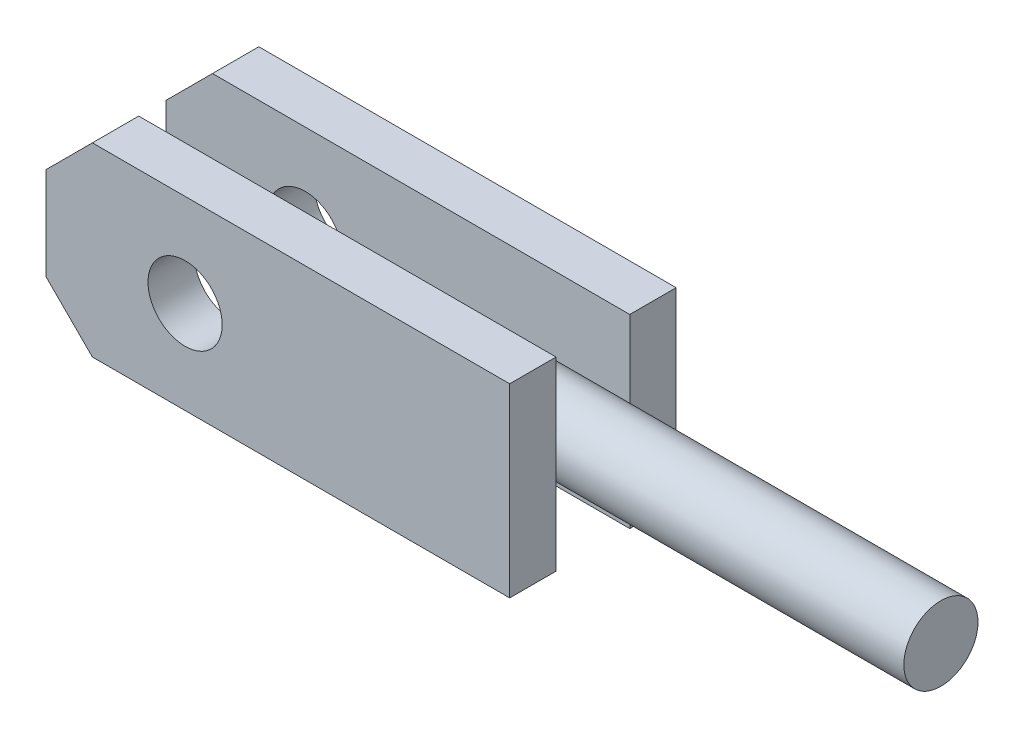
ISO-10303-21;
HEADER;
FILE_DESCRIPTION(('STEP AP214'),'2;1');
FILE_NAME('part.step','',(''),(''),'','','');
FILE_SCHEMA(('AUTOMOTIVE_DESIGN { 1 0 10303 214 1 1 1 1 }'));
ENDSEC;
DATA;
#1=APPLICATION_CONTEXT('core data for automotive mechanical design processes');
#2=APPLICATION_PROTOCOL_DEFINITION('international standard','automotive_design',2000,#1);
#3=PRODUCT_CONTEXT('',#1,'mechanical');
#4=PRODUCT('Part','Part','',(#3));
#5=PRODUCT_RELATED_PRODUCT_CATEGORY('part','',(#4));
#6=PRODUCT_DEFINITION_FORMATION('','',#4);
#7=PRODUCT_DEFINITION_CONTEXT('part definition',#1,'design');
#8=PRODUCT_DEFINITION('design','',#6,#7);
#9=PRODUCT_DEFINITION_SHAPE('','',#8);
#10=(LENGTH_UNIT() NAMED_UNIT(*) SI_UNIT(.MILLI.,.METRE.));
#11=(NAMED_UNIT(*) PLANE_ANGLE_UNIT() SI_UNIT($,.RADIAN.));
#12=(NAMED_UNIT(*) SI_UNIT($,.STERADIAN.) SOLID_ANGLE_UNIT());
#13=UNCERTAINTY_MEASURE_WITH_UNIT(LENGTH_MEASURE(1.E-05),#10,'distance_accuracy_value','');
#14=(GEOMETRIC_REPRESENTATION_CONTEXT(3) GLOBAL_UNCERTAINTY_ASSIGNED_CONTEXT((#13)) GLOBAL_UNIT_ASSIGNED_CONTEXT((#10,
#11,#12)) REPRESENTATION_CONTEXT('',''));
#15=CARTESIAN_POINT('',(0.,0.,0.));
#16=DIRECTION('',(0.,0.,1.));
#17=DIRECTION('',(1.,0.,0.));
#18=AXIS2_PLACEMENT_3D('',#15,#16,#17);
#19=CARTESIAN_POINT('',(30.,0.,-8.));
#20=DIRECTION('',(1.,0.,0.));
#21=DIRECTION('',(0.,0.,-1.));
#22=AXIS2_PLACEMENT_3D('',#19,#20,#21);
#23=CYLINDRICAL_SURFACE('',#22,8.);
#24=DIRECTION('',(1.,0.,0.));
#25=VECTOR('',#24,1.);
#26=CARTESIAN_POINT('',(30.,-1.26095202129188,-15.9));
#27=LINE('',#26,#25);
#28=CARTESIAN_POINT('',(50.,-1.26095202129188,-15.9));
#29=VERTEX_POINT('',#28);
#30=CARTESIAN_POINT('',(30.,-1.26095202129188,-15.9));
#31=VERTEX_POINT('',#30);
#32=EDGE_CURVE('E154',#29,#31,#27,.F.);
#33=ORIENTED_EDGE('',*,*,#32,.F.);
#34=CARTESIAN_POINT('',(50.,0.,-8.));
#35=DIRECTION('',(-1.,0.,0.));
#36=DIRECTION('',(0.,0.,1.));
#37=AXIS2_PLACEMENT_3D('',#34,#35,#36);
#38=CIRCLE('',#37,8.);
#39=CARTESIAN_POINT('',(50.,1.26095202129188,-15.9));
#40=VERTEX_POINT('',#39);
#41=EDGE_CURVE('E135',#29,#40,#38,.F.);
#42=ORIENTED_EDGE('',*,*,#41,.T.);
#43=DIRECTION('',(1.,0.,0.));
#44=VECTOR('',#43,1.);
#45=CARTESIAN_POINT('',(30.,1.26095202129188,-15.9));
#46=LINE('',#45,#44);
#47=CARTESIAN_POINT('',(30.,1.26095202129188,-15.9));
#48=VERTEX_POINT('',#47);
#49=EDGE_CURVE('E129',#48,#40,#46,.T.);
#50=ORIENTED_EDGE('',*,*,#49,.F.);
#51=CARTESIAN_POINT('',(30.,0.,-8.));
#52=DIRECTION('',(1.,0.,0.));
#53=DIRECTION('',(0.,0.,-1.));
#54=AXIS2_PLACEMENT_3D('',#51,#52,#53);
#55=CIRCLE('',#54,8.);
#56=EDGE_CURVE('E159',#48,#31,#55,.T.);
#57=ORIENTED_EDGE('',*,*,#56,.T.);
#58=EDGE_LOOP('',(#33,#42,#50,#57));
#59=FACE_BOUND('',#58,.T.);
#60=CARTESIAN_POINT('',(125.,0.,-8.));
#61=DIRECTION('',(1.,0.,0.));
#62=DIRECTION('',(0.,0.,-1.));
#63=AXIS2_PLACEMENT_3D('',#60,#61,#62);
#64=CIRCLE('',#63,8.);
#65=CARTESIAN_POINT('',(125.,0.,-16.));
#66=VERTEX_POINT('',#65);
#67=EDGE_CURVE('E156',#66,#66,#64,.T.);
#68=ORIENTED_EDGE('',*,*,#67,.F.);
#69=EDGE_LOOP('',(#68));
#70=FACE_BOUND('',#69,.T.);
#71=ADVANCED_FACE('F45',(#59,#70),#23,.T.);
#72=CARTESIAN_POINT('',(30.,0.,-8.));
#73=DIRECTION('',(1.,0.,0.));
#74=DIRECTION('',(0.,0.,-1.));
#75=AXIS2_PLACEMENT_3D('',#72,#73,#74);
#76=PLANE('',#75);
#77=ORIENTED_EDGE('',*,*,#56,.F.);
#78=DIRECTION('',(0.,-1.,0.));
#79=VECTOR('',#78,1.);
#80=CARTESIAN_POINT('',(30.,0.,-15.9));
#81=LINE('',#80,#79);
#82=EDGE_CURVE('E162',#48,#31,#81,.T.);
#83=ORIENTED_EDGE('',*,*,#82,.T.);
#84=EDGE_LOOP('',(#77,#83));
#85=FACE_BOUND('',#84,.T.);
#86=ADVANCED_FACE('F209',(#85),#76,.F.);
#87=CARTESIAN_POINT('',(125.,0.,-8.));
#88=DIRECTION('',(1.,0.,0.));
#89=DIRECTION('',(0.,0.,-1.));
#90=AXIS2_PLACEMENT_3D('',#87,#88,#89);
#91=PLANE('',#90);
#92=ORIENTED_EDGE('',*,*,#67,.T.);
#93=EDGE_LOOP('',(#92));
#94=FACE_BOUND('',#93,.T.);
#95=ADVANCED_FACE('F215',(#94),#91,.T.);
#96=CARTESIAN_POINT('',(-50.,-20.,-15.9));
#97=DIRECTION('',(1.,0.,0.));
#98=DIRECTION('',(0.,1.,0.));
#99=AXIS2_PLACEMENT_3D('',#96,#97,#98);
#100=PLANE('',#99);
#101=DIRECTION('',(0.,-1.,0.));
#102=VECTOR('',#101,1.);
#103=CARTESIAN_POINT('',(-50.,-20.,-25.9));
#104=LINE('',#103,#102);
#105=CARTESIAN_POINT('',(-50.,10.,-25.9));
#106=VERTEX_POINT('',#105);
#107=CARTESIAN_POINT('',(-50.,-9.99999999999997,-25.9));
#108=VERTEX_POINT('',#107);
#109=EDGE_CURVE('E142',#106,#108,#104,.T.);
#110=ORIENTED_EDGE('',*,*,#109,.T.);
#111=DIRECTION('',(0.,0.,1.));
#112=VECTOR('',#111,1.);
#113=CARTESIAN_POINT('',(-50.,-9.99999999999997,-15.9));
#114=LINE('',#113,#112);
#115=CARTESIAN_POINT('',(-50.,-9.99999999999997,-15.9));
#116=VERTEX_POINT('',#115);
#117=EDGE_CURVE('E53',#108,#116,#114,.T.);
#118=ORIENTED_EDGE('',*,*,#117,.T.);
#119=DIRECTION('',(0.,-1.,0.));
#120=VECTOR('',#119,1.);
#121=CARTESIAN_POINT('',(-50.,-20.,-15.9));
#122=LINE('',#121,#120);
#123=CARTESIAN_POINT('',(-50.,10.,-15.9));
#124=VERTEX_POINT('',#123);
#125=EDGE_CURVE('E121',#124,#116,#122,.T.);
#126=ORIENTED_EDGE('',*,*,#125,.F.);
#127=DIRECTION('',(0.,0.,-1.));
#128=VECTOR('',#127,1.);
#129=CARTESIAN_POINT('',(-50.,10.,-15.9));
#130=LINE('',#129,#128);
#131=EDGE_CURVE('E166',#124,#106,#130,.T.);
#132=ORIENTED_EDGE('',*,*,#131,.T.);
#133=EDGE_LOOP('',(#110,#118,#126,#132));
#134=FACE_BOUND('',#133,.T.);
#135=ADVANCED_FACE('F189',(#134),#100,.F.);
#136=CARTESIAN_POINT('',(50.,-20.,-15.9));
#137=DIRECTION('',(0.,1.,0.));
#138=DIRECTION('',(-1.,0.,0.));
#139=AXIS2_PLACEMENT_3D('',#136,#137,#138);
#140=PLANE('',#139);
#141=DIRECTION('',(1.,0.,0.));
#142=VECTOR('',#141,1.);
#143=CARTESIAN_POINT('',(50.,-20.,-15.9));
#144=LINE('',#143,#142);
#145=CARTESIAN_POINT('',(-40.,-20.,-15.9));
#146=VERTEX_POINT('',#145);
#147=CARTESIAN_POINT('',(50.,-20.,-15.9));
#148=VERTEX_POINT('',#147);
#149=EDGE_CURVE('E110',#146,#148,#144,.T.);
#150=ORIENTED_EDGE('',*,*,#149,.F.);
#151=DIRECTION('',(0.,0.,-1.));
#152=VECTOR('',#151,1.);
#153=CARTESIAN_POINT('',(-40.,-20.,-15.9));
#154=LINE('',#153,#152);
#155=CARTESIAN_POINT('',(-40.,-20.,-25.9));
#156=VERTEX_POINT('',#155);
#157=EDGE_CURVE('E175',#146,#156,#154,.T.);
#158=ORIENTED_EDGE('',*,*,#157,.T.);
#159=DIRECTION('',(1.,0.,0.));
#160=VECTOR('',#159,1.);
#161=CARTESIAN_POINT('',(50.,-20.,-25.9));
#162=LINE('',#161,#160);
#163=CARTESIAN_POINT('',(50.,-20.,-25.9));
#164=VERTEX_POINT('',#163);
#165=EDGE_CURVE('E126',#156,#164,#162,.T.);
#166=ORIENTED_EDGE('',*,*,#165,.T.);
#167=DIRECTION('',(0.,0.,-1.));
#168=VECTOR('',#167,1.);
#169=CARTESIAN_POINT('',(50.,-20.,-15.9));
#170=LINE('',#169,#168);
#171=EDGE_CURVE('E124',#148,#164,#170,.T.);
#172=ORIENTED_EDGE('',*,*,#171,.F.);
#173=EDGE_LOOP('',(#150,#158,#166,#172));
#174=FACE_BOUND('',#173,.T.);
#175=ADVANCED_FACE('F125',(#174),#140,.F.);
#176=CARTESIAN_POINT('',(50.,-20.,-15.9));
#177=DIRECTION('',(-1.,0.,0.));
#178=DIRECTION('',(0.,0.,1.));
#179=AXIS2_PLACEMENT_3D('',#176,#177,#178);
#180=PLANE('',#179);
#181=ORIENTED_EDGE('',*,*,#41,.F.);
#182=DIRECTION('',(0.,1.,0.));
#183=VECTOR('',#182,1.);
#184=CARTESIAN_POINT('',(50.,-20.,-15.9));
#185=LINE('',#184,#183);
#186=EDGE_CURVE('E114',#148,#29,#185,.T.);
#187=ORIENTED_EDGE('',*,*,#186,.F.);
#188=ORIENTED_EDGE('',*,*,#171,.T.);
#189=DIRECTION('',(0.,1.,0.));
#190=VECTOR('',#189,1.);
#191=CARTESIAN_POINT('',(50.,-20.,-25.9));
#192=LINE('',#191,#190);
#193=CARTESIAN_POINT('',(50.,20.,-25.9));
#194=VERTEX_POINT('',#193);
#195=EDGE_CURVE('E146',#164,#194,#192,.T.);
#196=ORIENTED_EDGE('',*,*,#195,.T.);
#197=DIRECTION('',(0.,0.,-1.));
#198=VECTOR('',#197,1.);
#199=CARTESIAN_POINT('',(50.,20.,-15.9));
#200=LINE('',#199,#198);
#201=CARTESIAN_POINT('',(50.,20.,-15.9));
#202=VERTEX_POINT('',#201);
#203=EDGE_CURVE('E130',#202,#194,#200,.T.);
#204=ORIENTED_EDGE('',*,*,#203,.F.);
#205=EDGE_CURVE('E120',#40,#202,#185,.T.);
#206=ORIENTED_EDGE('',*,*,#205,.F.);
#207=EDGE_LOOP('',(#181,#187,#188,#196,#204,#206));
#208=FACE_BOUND('',#207,.T.);
#209=ADVANCED_FACE('F132',(#208),#180,.F.);
#210=CARTESIAN_POINT('',(50.,20.,-15.9));
#211=DIRECTION('',(0.,-1.,0.));
#212=DIRECTION('',(1.,0.,0.));
#213=AXIS2_PLACEMENT_3D('',#210,#211,#212);
#214=PLANE('',#213);
#215=DIRECTION('',(-1.,0.,0.));
#216=VECTOR('',#215,1.);
#217=CARTESIAN_POINT('',(50.,20.,-25.9));
#218=LINE('',#217,#216);
#219=CARTESIAN_POINT('',(-40.,20.,-25.9));
#220=VERTEX_POINT('',#219);
#221=EDGE_CURVE('E148',#194,#220,#218,.T.);
#222=ORIENTED_EDGE('',*,*,#221,.T.);
#223=DIRECTION('',(0.,0.,1.));
#224=VECTOR('',#223,1.);
#225=CARTESIAN_POINT('',(-40.,20.,-15.9));
#226=LINE('',#225,#224);
#227=CARTESIAN_POINT('',(-40.,20.,-15.9));
#228=VERTEX_POINT('',#227);
#229=EDGE_CURVE('E171',#220,#228,#226,.T.);
#230=ORIENTED_EDGE('',*,*,#229,.T.);
#231=DIRECTION('',(-1.,0.,0.));
#232=VECTOR('',#231,1.);
#233=CARTESIAN_POINT('',(50.,20.,-15.9));
#234=LINE('',#233,#232);
#235=EDGE_CURVE('E136',#202,#228,#234,.T.);
#236=ORIENTED_EDGE('',*,*,#235,.F.);
#237=ORIENTED_EDGE('',*,*,#203,.T.);
#238=EDGE_LOOP('',(#222,#230,#236,#237));
#239=FACE_BOUND('',#238,.T.);
#240=ADVANCED_FACE('F183',(#239),#214,.F.);
#241=CARTESIAN_POINT('',(0.,0.,-15.9));
#242=DIRECTION('',(0.,0.,1.));
#243=DIRECTION('',(1.,0.,0.));
#244=AXIS2_PLACEMENT_3D('',#241,#242,#243);
#245=PLANE('',#244);
#246=CARTESIAN_POINT('',(-20.,0.,-15.9));
#247=DIRECTION('',(0.,0.,1.));
#248=DIRECTION('',(1.,0.,0.));
#249=AXIS2_PLACEMENT_3D('',#246,#247,#248);
#250=CIRCLE('',#249,8.);
#251=CARTESIAN_POINT('',(-12.,0.,-15.9));
#252=VERTEX_POINT('',#251);
#253=EDGE_CURVE('E144',#252,#252,#250,.T.);
#254=ORIENTED_EDGE('',*,*,#253,.F.);
#255=EDGE_LOOP('',(#254));
#256=FACE_BOUND('',#255,.T.);
#257=ORIENTED_EDGE('',*,*,#125,.T.);
#258=DIRECTION('',(-0.707106781186545,0.70710678118655,0.));
#259=VECTOR('',#258,1.);
#260=CARTESIAN_POINT('',(-30.0000000000001,-30.,-15.9));
#261=LINE('',#260,#259);
#262=EDGE_CURVE('E12',#116,#146,#261,.F.);
#263=ORIENTED_EDGE('',*,*,#262,.T.);
#264=ORIENTED_EDGE('',*,*,#149,.T.);
#265=ORIENTED_EDGE('',*,*,#186,.T.);
#266=ORIENTED_EDGE('',*,*,#32,.T.);
#267=ORIENTED_EDGE('',*,*,#82,.F.);
#268=ORIENTED_EDGE('',*,*,#49,.T.);
#269=ORIENTED_EDGE('',*,*,#205,.T.);
#270=ORIENTED_EDGE('',*,*,#235,.T.);
#271=DIRECTION('',(0.707106781186548,0.707106781186547,0.));
#272=VECTOR('',#271,1.);
#273=CARTESIAN_POINT('',(-30.,30.,-15.9));
#274=LINE('',#273,#272);
#275=EDGE_CURVE('E173',#228,#124,#274,.F.);
#276=ORIENTED_EDGE('',*,*,#275,.T.);
#277=EDGE_LOOP('',(#257,#263,#264,#265,#266,#267,#268,#269,#270,#276));
#278=FACE_BOUND('',#277,.T.);
#279=ADVANCED_FACE('F112',(#256,#278),#245,.T.);
#280=CARTESIAN_POINT('',(0.,0.,-25.9));
#281=DIRECTION('',(0.,0.,1.));
#282=DIRECTION('',(1.,0.,0.));
#283=AXIS2_PLACEMENT_3D('',#280,#281,#282);
#284=PLANE('',#283);
#285=CARTESIAN_POINT('',(-20.,0.,-25.9));
#286=DIRECTION('',(0.,0.,-1.));
#287=DIRECTION('',(-1.,0.,0.));
#288=AXIS2_PLACEMENT_3D('',#285,#286,#287);
#289=CIRCLE('',#288,8.);
#290=CARTESIAN_POINT('',(-28.,0.,-25.9));
#291=VERTEX_POINT('',#290);
#292=EDGE_CURVE('E193',#291,#291,#289,.T.);
#293=ORIENTED_EDGE('',*,*,#292,.F.);
#294=EDGE_LOOP('',(#293));
#295=FACE_BOUND('',#294,.T.);
#296=ORIENTED_EDGE('',*,*,#165,.F.);
#297=DIRECTION('',(0.707106781186545,-0.70710678118655,0.));
#298=VECTOR('',#297,1.);
#299=CARTESIAN_POINT('',(-40.,-20.,-25.9));
#300=LINE('',#299,#298);
#301=EDGE_CURVE('E67',#156,#108,#300,.F.);
#302=ORIENTED_EDGE('',*,*,#301,.T.);
#303=ORIENTED_EDGE('',*,*,#109,.F.);
#304=DIRECTION('',(-0.707106781186548,-0.707106781186547,0.));
#305=VECTOR('',#304,1.);
#306=CARTESIAN_POINT('',(-50.,10.,-25.9));
#307=LINE('',#306,#305);
#308=EDGE_CURVE('E169',#106,#220,#307,.F.);
#309=ORIENTED_EDGE('',*,*,#308,.T.);
#310=ORIENTED_EDGE('',*,*,#221,.F.);
#311=ORIENTED_EDGE('',*,*,#195,.F.);
#312=EDGE_LOOP('',(#296,#302,#303,#309,#310,#311));
#313=FACE_BOUND('',#312,.T.);
#314=ADVANCED_FACE('F178',(#295,#313),#284,.F.);
#315=CARTESIAN_POINT('',(-50.,10.,-15.9));
#316=DIRECTION('',(0.707106781186547,-0.707106781186548,0.));
#317=DIRECTION('',(0.,0.,-1.));
#318=AXIS2_PLACEMENT_3D('',#315,#316,#317);
#319=PLANE('',#318);
#320=ORIENTED_EDGE('',*,*,#275,.F.);
#321=ORIENTED_EDGE('',*,*,#229,.F.);
#322=ORIENTED_EDGE('',*,*,#308,.F.);
#323=ORIENTED_EDGE('',*,*,#131,.F.);
#324=EDGE_LOOP('',(#320,#321,#322,#323));
#325=FACE_BOUND('',#324,.T.);
#326=ADVANCED_FACE('F188',(#325),#319,.F.);
#327=CARTESIAN_POINT('',(-40.,-20.,-15.9));
#328=DIRECTION('',(0.70710678118655,0.707106781186545,0.));
#329=DIRECTION('',(0.,0.,-1.));
#330=AXIS2_PLACEMENT_3D('',#327,#328,#329);
#331=PLANE('',#330);
#332=ORIENTED_EDGE('',*,*,#262,.F.);
#333=ORIENTED_EDGE('',*,*,#117,.F.);
#334=ORIENTED_EDGE('',*,*,#301,.F.);
#335=ORIENTED_EDGE('',*,*,#157,.F.);
#336=EDGE_LOOP('',(#332,#333,#334,#335));
#337=FACE_BOUND('',#336,.T.);
#338=ADVANCED_FACE('F47',(#337),#331,.F.);
#339=CARTESIAN_POINT('',(-20.,0.,74.1));
#340=DIRECTION('',(0.,0.,-1.));
#341=DIRECTION('',(-1.,0.,0.));
#342=AXIS2_PLACEMENT_3D('',#339,#340,#341);
#343=CYLINDRICAL_SURFACE('',#342,8.);
#344=ORIENTED_EDGE('',*,*,#253,.T.);
#345=EDGE_LOOP('',(#344));
#346=FACE_BOUND('',#345,.T.);
#347=ORIENTED_EDGE('',*,*,#292,.T.);
#348=EDGE_LOOP('',(#347));
#349=FACE_BOUND('',#348,.T.);
#350=ADVANCED_FACE('F197',(#346,#349),#343,.F.);
#351=CLOSED_SHELL('',(#71,#86,#95,#135,#175,#209,#240,#279,#314,#326,#338,#350));
#352=MANIFOLD_SOLID_BREP('B2',#351);
#353=CARTESIAN_POINT('',(-50.,-20.,10.));
#354=DIRECTION('',(1.,0.,0.));
#355=DIRECTION('',(0.,1.,0.));
#356=AXIS2_PLACEMENT_3D('',#353,#354,#355);
#357=PLANE('',#356);
#358=DIRECTION('',(0.,-1.,0.));
#359=VECTOR('',#358,1.);
#360=CARTESIAN_POINT('',(-50.,-20.,0.));
#361=LINE('',#360,#359);
#362=CARTESIAN_POINT('',(-50.,10.,0.));
#363=VERTEX_POINT('',#362);
#364=CARTESIAN_POINT('',(-50.,-9.99999999999997,0.));
#365=VERTEX_POINT('',#364);
#366=EDGE_CURVE('E390',#363,#365,#361,.T.);
#367=ORIENTED_EDGE('',*,*,#366,.T.);
#368=DIRECTION('',(0.,0.,1.));
#369=VECTOR('',#368,1.);
#370=CARTESIAN_POINT('',(-50.,-9.99999999999997,10.));
#371=LINE('',#370,#369);
#372=CARTESIAN_POINT('',(-50.,-9.99999999999997,10.));
#373=VERTEX_POINT('',#372);
#374=EDGE_CURVE('E316',#365,#373,#371,.T.);
#375=ORIENTED_EDGE('',*,*,#374,.T.);
#376=DIRECTION('',(0.,-1.,0.));
#377=VECTOR('',#376,1.);
#378=CARTESIAN_POINT('',(-50.,-20.,10.));
#379=LINE('',#378,#377);
#380=CARTESIAN_POINT('',(-50.,10.,10.));
#381=VERTEX_POINT('',#380);
#382=EDGE_CURVE('E371',#381,#373,#379,.T.);
#383=ORIENTED_EDGE('',*,*,#382,.F.);
#384=DIRECTION('',(0.,0.,-1.));
#385=VECTOR('',#384,1.);
#386=CARTESIAN_POINT('',(-50.,10.,10.));
#387=LINE('',#386,#385);
#388=EDGE_CURVE('E379',#381,#363,#387,.T.);
#389=ORIENTED_EDGE('',*,*,#388,.T.);
#390=EDGE_LOOP('',(#367,#375,#383,#389));
#391=FACE_BOUND('',#390,.T.);
#392=ADVANCED_FACE('F308',(#391),#357,.F.);
#393=CARTESIAN_POINT('',(50.,-20.,10.));
#394=DIRECTION('',(0.,1.,0.));
#395=DIRECTION('',(-1.,0.,0.));
#396=AXIS2_PLACEMENT_3D('',#393,#394,#395);
#397=PLANE('',#396);
#398=DIRECTION('',(1.,0.,0.));
#399=VECTOR('',#398,1.);
#400=CARTESIAN_POINT('',(50.,-20.,10.));
#401=LINE('',#400,#399);
#402=CARTESIAN_POINT('',(-40.,-20.,10.));
#403=VERTEX_POINT('',#402);
#404=CARTESIAN_POINT('',(50.,-20.,10.));
#405=VERTEX_POINT('',#404);
#406=EDGE_CURVE('E360',#403,#405,#401,.T.);
#407=ORIENTED_EDGE('',*,*,#406,.F.);
#408=DIRECTION('',(0.,0.,-1.));
#409=VECTOR('',#408,1.);
#410=CARTESIAN_POINT('',(-40.,-20.,10.));
#411=LINE('',#410,#409);
#412=CARTESIAN_POINT('',(-40.,-20.,0.));
#413=VERTEX_POINT('',#412);
#414=EDGE_CURVE('E408',#403,#413,#411,.T.);
#415=ORIENTED_EDGE('',*,*,#414,.T.);
#416=DIRECTION('',(1.,0.,0.));
#417=VECTOR('',#416,1.);
#418=CARTESIAN_POINT('',(50.,-20.,0.));
#419=LINE('',#418,#417);
#420=CARTESIAN_POINT('',(50.,-20.,0.));
#421=VERTEX_POINT('',#420);
#422=EDGE_CURVE('E376',#413,#421,#419,.T.);
#423=ORIENTED_EDGE('',*,*,#422,.T.);
#424=DIRECTION('',(0.,0.,-1.));
#425=VECTOR('',#424,1.);
#426=CARTESIAN_POINT('',(50.,-20.,10.));
#427=LINE('',#426,#425);
#428=EDGE_CURVE('E374',#405,#421,#427,.T.);
#429=ORIENTED_EDGE('',*,*,#428,.F.);
#430=EDGE_LOOP('',(#407,#415,#423,#429));
#431=FACE_BOUND('',#430,.T.);
#432=ADVANCED_FACE('F375',(#431),#397,.F.);
#433=CARTESIAN_POINT('',(50.,-20.,10.));
#434=DIRECTION('',(-1.,0.,0.));
#435=DIRECTION('',(0.,0.,1.));
#436=AXIS2_PLACEMENT_3D('',#433,#434,#435);
#437=PLANE('',#436);
#438=DIRECTION('',(0.,1.,0.));
#439=VECTOR('',#438,1.);
#440=CARTESIAN_POINT('',(50.,-20.,0.));
#441=LINE('',#440,#439);
#442=CARTESIAN_POINT('',(50.,20.,0.));
#443=VERTEX_POINT('',#442);
#444=EDGE_CURVE('E394',#421,#443,#441,.T.);
#445=ORIENTED_EDGE('',*,*,#444,.T.);
#446=DIRECTION('',(0.,0.,-1.));
#447=VECTOR('',#446,1.);
#448=CARTESIAN_POINT('',(50.,20.,10.));
#449=LINE('',#448,#447);
#450=CARTESIAN_POINT('',(50.,20.,10.));
#451=VERTEX_POINT('',#450);
#452=EDGE_CURVE('E380',#451,#443,#449,.T.);
#453=ORIENTED_EDGE('',*,*,#452,.F.);
#454=DIRECTION('',(0.,1.,0.));
#455=VECTOR('',#454,1.);
#456=CARTESIAN_POINT('',(50.,-20.,10.));
#457=LINE('',#456,#455);
#458=EDGE_CURVE('E365',#405,#451,#457,.T.);
#459=ORIENTED_EDGE('',*,*,#458,.F.);
#460=ORIENTED_EDGE('',*,*,#428,.T.);
#461=EDGE_LOOP('',(#445,#453,#459,#460));
#462=FACE_BOUND('',#461,.T.);
#463=ADVANCED_FACE('F382',(#462),#437,.F.);
#464=CARTESIAN_POINT('',(50.,20.,10.));
#465=DIRECTION('',(0.,-1.,0.));
#466=DIRECTION('',(1.,0.,0.));
#467=AXIS2_PLACEMENT_3D('',#464,#465,#466);
#468=PLANE('',#467);
#469=DIRECTION('',(-1.,0.,0.));
#470=VECTOR('',#469,1.);
#471=CARTESIAN_POINT('',(50.,20.,0.));
#472=LINE('',#471,#470);
#473=CARTESIAN_POINT('',(-40.,20.,0.));
#474=VERTEX_POINT('',#473);
#475=EDGE_CURVE('E396',#443,#474,#472,.T.);
#476=ORIENTED_EDGE('',*,*,#475,.T.);
#477=DIRECTION('',(0.,0.,1.));
#478=VECTOR('',#477,1.);
#479=CARTESIAN_POINT('',(-40.,20.,10.));
#480=LINE('',#479,#478);
#481=CARTESIAN_POINT('',(-40.,20.,10.));
#482=VERTEX_POINT('',#481);
#483=EDGE_CURVE('E404',#474,#482,#480,.T.);
#484=ORIENTED_EDGE('',*,*,#483,.T.);
#485=DIRECTION('',(-1.,0.,0.));
#486=VECTOR('',#485,1.);
#487=CARTESIAN_POINT('',(50.,20.,10.));
#488=LINE('',#487,#486);
#489=EDGE_CURVE('E385',#451,#482,#488,.T.);
#490=ORIENTED_EDGE('',*,*,#489,.F.);
#491=ORIENTED_EDGE('',*,*,#452,.T.);
#492=EDGE_LOOP('',(#476,#484,#490,#491));
#493=FACE_BOUND('',#492,.T.);
#494=ADVANCED_FACE('F414',(#493),#468,.F.);
#495=CARTESIAN_POINT('',(0.,0.,10.));
#496=DIRECTION('',(0.,0.,1.));
#497=DIRECTION('',(1.,0.,0.));
#498=AXIS2_PLACEMENT_3D('',#495,#496,#497);
#499=PLANE('',#498);
#500=CARTESIAN_POINT('',(-20.,0.,10.));
#501=DIRECTION('',(0.,0.,1.));
#502=DIRECTION('',(1.,0.,0.));
#503=AXIS2_PLACEMENT_3D('',#500,#501,#502);
#504=CIRCLE('',#503,8.);
#505=CARTESIAN_POINT('',(-12.,0.,10.));
#506=VERTEX_POINT('',#505);
#507=EDGE_CURVE('E421',#506,#506,#504,.T.);
#508=ORIENTED_EDGE('',*,*,#507,.F.);
#509=EDGE_LOOP('',(#508));
#510=FACE_BOUND('',#509,.T.);
#511=ORIENTED_EDGE('',*,*,#382,.T.);
#512=DIRECTION('',(-0.707106781186546,0.707106781186549,0.));
#513=VECTOR('',#512,1.);
#514=CARTESIAN_POINT('',(-30.0000000000001,-30.,10.));
#515=LINE('',#514,#513);
#516=EDGE_CURVE('E43',#373,#403,#515,.F.);
#517=ORIENTED_EDGE('',*,*,#516,.T.);
#518=ORIENTED_EDGE('',*,*,#406,.T.);
#519=ORIENTED_EDGE('',*,*,#458,.T.);
#520=ORIENTED_EDGE('',*,*,#489,.T.);
#521=DIRECTION('',(0.707106781186549,0.707106781186546,0.));
#522=VECTOR('',#521,1.);
#523=CARTESIAN_POINT('',(-29.9999999999999,30.,10.));
#524=LINE('',#523,#522);
#525=EDGE_CURVE('E406',#482,#381,#524,.F.);
#526=ORIENTED_EDGE('',*,*,#525,.T.);
#527=EDGE_LOOP('',(#511,#517,#518,#519,#520,#526));
#528=FACE_BOUND('',#527,.T.);
#529=ADVANCED_FACE('F362',(#510,#528),#499,.T.);
#530=CARTESIAN_POINT('',(0.,0.,0.));
#531=DIRECTION('',(0.,0.,1.));
#532=DIRECTION('',(1.,0.,0.));
#533=AXIS2_PLACEMENT_3D('',#530,#531,#532);
#534=PLANE('',#533);
#535=CARTESIAN_POINT('',(-20.,0.,0.));
#536=DIRECTION('',(0.,0.,1.));
#537=DIRECTION('',(1.,0.,0.));
#538=AXIS2_PLACEMENT_3D('',#535,#536,#537);
#539=CIRCLE('',#538,8.);
#540=CARTESIAN_POINT('',(-12.,0.,0.));
#541=VERTEX_POINT('',#540);
#542=EDGE_CURVE('E392',#541,#541,#539,.T.);
#543=ORIENTED_EDGE('',*,*,#542,.T.);
#544=EDGE_LOOP('',(#543));
#545=FACE_BOUND('',#544,.T.);
#546=ORIENTED_EDGE('',*,*,#422,.F.);
#547=DIRECTION('',(0.707106781186546,-0.707106781186549,0.));
#548=VECTOR('',#547,1.);
#549=CARTESIAN_POINT('',(-40.,-20.,0.));
#550=LINE('',#549,#548);
#551=EDGE_CURVE('E330',#413,#365,#550,.F.);
#552=ORIENTED_EDGE('',*,*,#551,.T.);
#553=ORIENTED_EDGE('',*,*,#366,.F.);
#554=DIRECTION('',(-0.707106781186549,-0.707106781186546,0.));
#555=VECTOR('',#554,1.);
#556=CARTESIAN_POINT('',(-50.,10.,0.));
#557=LINE('',#556,#555);
#558=EDGE_CURVE('E402',#363,#474,#557,.F.);
#559=ORIENTED_EDGE('',*,*,#558,.T.);
#560=ORIENTED_EDGE('',*,*,#475,.F.);
#561=ORIENTED_EDGE('',*,*,#444,.F.);
#562=EDGE_LOOP('',(#546,#552,#553,#559,#560,#561));
#563=FACE_BOUND('',#562,.T.);
#564=ADVANCED_FACE('F411',(#545,#563),#534,.F.);
#565=CARTESIAN_POINT('',(-20.,0.,0.));
#566=DIRECTION('',(0.,0.,1.));
#567=DIRECTION('',(1.,0.,0.));
#568=AXIS2_PLACEMENT_3D('',#565,#566,#567);
#569=CYLINDRICAL_SURFACE('',#568,8.);
#570=ORIENTED_EDGE('',*,*,#542,.F.);
#571=EDGE_LOOP('',(#570));
#572=FACE_BOUND('',#571,.T.);
#573=ORIENTED_EDGE('',*,*,#507,.T.);
#574=EDGE_LOOP('',(#573));
#575=FACE_BOUND('',#574,.T.);
#576=ADVANCED_FACE('F428',(#572,#575),#569,.F.);
#577=CARTESIAN_POINT('',(-50.,10.,10.));
#578=DIRECTION('',(0.707106781186546,-0.707106781186549,0.));
#579=DIRECTION('',(0.,0.,-1.));
#580=AXIS2_PLACEMENT_3D('',#577,#578,#579);
#581=PLANE('',#580);
#582=ORIENTED_EDGE('',*,*,#525,.F.);
#583=ORIENTED_EDGE('',*,*,#483,.F.);
#584=ORIENTED_EDGE('',*,*,#558,.F.);
#585=ORIENTED_EDGE('',*,*,#388,.F.);
#586=EDGE_LOOP('',(#582,#583,#584,#585));
#587=FACE_BOUND('',#586,.T.);
#588=ADVANCED_FACE('F419',(#587),#581,.F.);
#589=CARTESIAN_POINT('',(-40.,-20.,10.));
#590=DIRECTION('',(0.707106781186549,0.707106781186546,0.));
#591=DIRECTION('',(0.,0.,-1.));
#592=AXIS2_PLACEMENT_3D('',#589,#590,#591);
#593=PLANE('',#592);
#594=ORIENTED_EDGE('',*,*,#516,.F.);
#595=ORIENTED_EDGE('',*,*,#374,.F.);
#596=ORIENTED_EDGE('',*,*,#551,.F.);
#597=ORIENTED_EDGE('',*,*,#414,.F.);
#598=EDGE_LOOP('',(#594,#595,#596,#597));
#599=FACE_BOUND('',#598,.T.);
#600=ADVANCED_FACE('F310',(#599),#593,.F.);
#601=CLOSED_SHELL('',(#392,#432,#463,#494,#529,#564,#576,#588,#600));
#602=MANIFOLD_SOLID_BREP('B6',#601);
#603=ADVANCED_BREP_SHAPE_REPRESENTATION('',(#18,#352,#602),#14);
#604=SHAPE_DEFINITION_REPRESENTATION(#9,#603);
ENDSEC;
END-ISO-10303-21;
